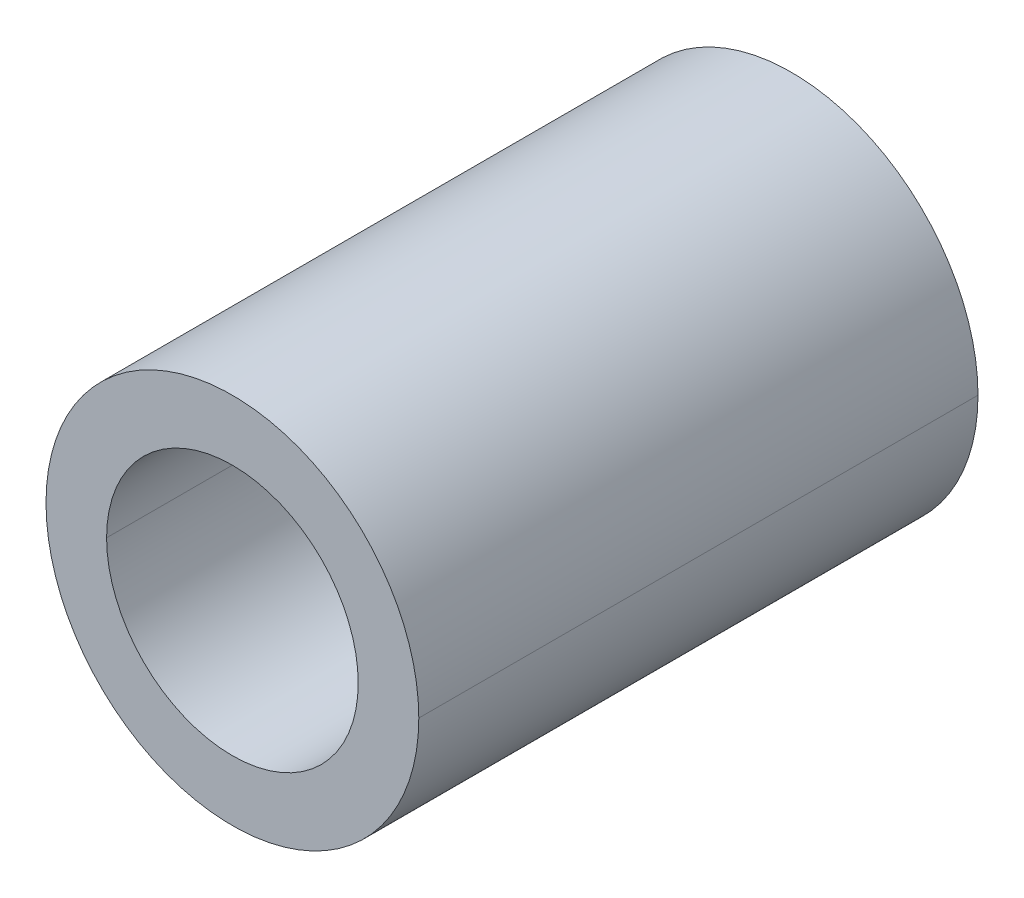
ISO-10303-21;
HEADER;
FILE_DESCRIPTION(('STEP AP214'),'2;1');
FILE_NAME('part.step','',(''),(''),'','','');
FILE_SCHEMA(('AUTOMOTIVE_DESIGN { 1 0 10303 214 1 1 1 1 }'));
ENDSEC;
DATA;
#1=APPLICATION_CONTEXT('core data for automotive mechanical design processes');
#2=APPLICATION_PROTOCOL_DEFINITION('international standard','automotive_design',2000,#1);
#3=PRODUCT_CONTEXT('',#1,'mechanical');
#4=PRODUCT('Part','Part','',(#3));
#5=PRODUCT_RELATED_PRODUCT_CATEGORY('part','',(#4));
#6=PRODUCT_DEFINITION_FORMATION('','',#4);
#7=PRODUCT_DEFINITION_CONTEXT('part definition',#1,'design');
#8=PRODUCT_DEFINITION('design','',#6,#7);
#9=PRODUCT_DEFINITION_SHAPE('','',#8);
#10=(LENGTH_UNIT() NAMED_UNIT(*) SI_UNIT(.MILLI.,.METRE.));
#11=(NAMED_UNIT(*) PLANE_ANGLE_UNIT() SI_UNIT($,.RADIAN.));
#12=(NAMED_UNIT(*) SI_UNIT($,.STERADIAN.) SOLID_ANGLE_UNIT());
#13=UNCERTAINTY_MEASURE_WITH_UNIT(LENGTH_MEASURE(1.E-05),#10,'distance_accuracy_value','');
#14=(GEOMETRIC_REPRESENTATION_CONTEXT(3) GLOBAL_UNCERTAINTY_ASSIGNED_CONTEXT((#13)) GLOBAL_UNIT_ASSIGNED_CONTEXT((#10,
#11,#12)) REPRESENTATION_CONTEXT('',''));
#15=CARTESIAN_POINT('',(0.,0.,0.));
#16=DIRECTION('',(0.,0.,1.));
#17=DIRECTION('',(1.,0.,0.));
#18=AXIS2_PLACEMENT_3D('',#15,#16,#17);
#19=CARTESIAN_POINT('',(0.,0.,6.));
#20=DIRECTION('',(0.,0.,-1.));
#21=DIRECTION('',(-1.,0.,0.));
#22=AXIS2_PLACEMENT_3D('',#19,#20,#21);
#23=CYLINDRICAL_SURFACE('',#22,1.35);
#24=DIRECTION('',(0.,0.,-1.));
#25=VECTOR('',#24,1.);
#26=CARTESIAN_POINT('',(1.35,0.,6.));
#27=LINE('',#26,#25);
#28=CARTESIAN_POINT('',(1.35,0.,6.));
#29=VERTEX_POINT('',#28);
#30=CARTESIAN_POINT('',(1.35,0.,0.));
#31=VERTEX_POINT('',#30);
#32=EDGE_CURVE('E110',#29,#31,#27,.T.);
#33=ORIENTED_EDGE('',*,*,#32,.F.);
#34=CARTESIAN_POINT('',(0.,0.,6.));
#35=DIRECTION('',(0.,0.,1.));
#36=DIRECTION('',(1.,0.,0.));
#37=AXIS2_PLACEMENT_3D('',#34,#35,#36);
#38=CIRCLE('',#37,1.35);
#39=CARTESIAN_POINT('',(-1.35,0.,6.));
#40=VERTEX_POINT('',#39);
#41=EDGE_CURVE('E65',#29,#40,#38,.T.);
#42=ORIENTED_EDGE('',*,*,#41,.T.);
#43=DIRECTION('',(0.,0.,-1.));
#44=VECTOR('',#43,1.);
#45=CARTESIAN_POINT('',(-1.35,0.,6.));
#46=LINE('',#45,#44);
#47=CARTESIAN_POINT('',(-1.35,0.,0.));
#48=VERTEX_POINT('',#47);
#49=EDGE_CURVE('E102',#40,#48,#46,.T.);
#50=ORIENTED_EDGE('',*,*,#49,.T.);
#51=CARTESIAN_POINT('',(0.,0.,0.));
#52=DIRECTION('',(0.,0.,1.));
#53=DIRECTION('',(1.,0.,0.));
#54=AXIS2_PLACEMENT_3D('',#51,#52,#53);
#55=CIRCLE('',#54,1.35);
#56=EDGE_CURVE('E11',#31,#48,#55,.T.);
#57=ORIENTED_EDGE('',*,*,#56,.F.);
#58=EDGE_LOOP('',(#33,#42,#50,#57));
#59=FACE_BOUND('',#58,.T.);
#60=ADVANCED_FACE('F17',(#59),#23,.F.);
#61=CARTESIAN_POINT('',(0.,0.,6.));
#62=DIRECTION('',(0.,0.,-1.));
#63=DIRECTION('',(-1.,0.,0.));
#64=AXIS2_PLACEMENT_3D('',#61,#62,#63);
#65=CYLINDRICAL_SURFACE('',#64,2.);
#66=DIRECTION('',(0.,0.,-1.));
#67=VECTOR('',#66,1.);
#68=CARTESIAN_POINT('',(2.,0.,6.));
#69=LINE('',#68,#67);
#70=CARTESIAN_POINT('',(2.,0.,6.));
#71=VERTEX_POINT('',#70);
#72=CARTESIAN_POINT('',(2.,0.,0.));
#73=VERTEX_POINT('',#72);
#74=EDGE_CURVE('E21',#71,#73,#69,.T.);
#75=ORIENTED_EDGE('',*,*,#74,.F.);
#76=CARTESIAN_POINT('',(0.,0.,6.));
#77=DIRECTION('',(0.,0.,1.));
#78=DIRECTION('',(1.,0.,0.));
#79=AXIS2_PLACEMENT_3D('',#76,#77,#78);
#80=CIRCLE('',#79,2.);
#81=CARTESIAN_POINT('',(-2.,0.,6.));
#82=VERTEX_POINT('',#81);
#83=EDGE_CURVE('E81',#82,#71,#80,.T.);
#84=ORIENTED_EDGE('',*,*,#83,.F.);
#85=DIRECTION('',(0.,0.,-1.));
#86=VECTOR('',#85,1.);
#87=CARTESIAN_POINT('',(-2.,0.,6.));
#88=LINE('',#87,#86);
#89=CARTESIAN_POINT('',(-2.,0.,0.));
#90=VERTEX_POINT('',#89);
#91=EDGE_CURVE('E92',#82,#90,#88,.T.);
#92=ORIENTED_EDGE('',*,*,#91,.T.);
#93=CARTESIAN_POINT('',(0.,0.,0.));
#94=DIRECTION('',(0.,0.,1.));
#95=DIRECTION('',(1.,0.,0.));
#96=AXIS2_PLACEMENT_3D('',#93,#94,#95);
#97=CIRCLE('',#96,2.);
#98=EDGE_CURVE('E28',#90,#73,#97,.T.);
#99=ORIENTED_EDGE('',*,*,#98,.T.);
#100=EDGE_LOOP('',(#75,#84,#92,#99));
#101=FACE_BOUND('',#100,.T.);
#102=ADVANCED_FACE('F95',(#101),#65,.T.);
#103=CARTESIAN_POINT('',(0.,0.,0.));
#104=DIRECTION('',(0.,0.,1.));
#105=DIRECTION('',(1.,0.,0.));
#106=AXIS2_PLACEMENT_3D('',#103,#104,#105);
#107=PLANE('',#106);
#108=CARTESIAN_POINT('',(0.,0.,0.));
#109=DIRECTION('',(0.,0.,1.));
#110=DIRECTION('',(1.,0.,0.));
#111=AXIS2_PLACEMENT_3D('',#108,#109,#110);
#112=CIRCLE('',#111,1.35);
#113=EDGE_CURVE('E107',#48,#31,#112,.T.);
#114=ORIENTED_EDGE('',*,*,#113,.T.);
#115=ORIENTED_EDGE('',*,*,#56,.T.);
#116=EDGE_LOOP('',(#114,#115));
#117=FACE_BOUND('',#116,.T.);
#118=ORIENTED_EDGE('',*,*,#98,.F.);
#119=CARTESIAN_POINT('',(0.,0.,0.));
#120=DIRECTION('',(0.,0.,1.));
#121=DIRECTION('',(1.,0.,0.));
#122=AXIS2_PLACEMENT_3D('',#119,#120,#121);
#123=CIRCLE('',#122,2.);
#124=EDGE_CURVE('E99',#73,#90,#123,.T.);
#125=ORIENTED_EDGE('',*,*,#124,.F.);
#126=EDGE_LOOP('',(#118,#125));
#127=FACE_BOUND('',#126,.T.);
#128=ADVANCED_FACE('F129',(#117,#127),#107,.F.);
#129=CARTESIAN_POINT('',(0.,0.,6.));
#130=DIRECTION('',(0.,0.,1.));
#131=DIRECTION('',(1.,0.,0.));
#132=AXIS2_PLACEMENT_3D('',#129,#130,#131);
#133=PLANE('',#132);
#134=CARTESIAN_POINT('',(0.,0.,6.));
#135=DIRECTION('',(0.,0.,1.));
#136=DIRECTION('',(1.,0.,0.));
#137=AXIS2_PLACEMENT_3D('',#134,#135,#136);
#138=CIRCLE('',#137,1.35);
#139=EDGE_CURVE('E113',#40,#29,#138,.T.);
#140=ORIENTED_EDGE('',*,*,#139,.F.);
#141=ORIENTED_EDGE('',*,*,#41,.F.);
#142=EDGE_LOOP('',(#140,#141));
#143=FACE_BOUND('',#142,.T.);
#144=ORIENTED_EDGE('',*,*,#83,.T.);
#145=CARTESIAN_POINT('',(0.,0.,6.));
#146=DIRECTION('',(0.,0.,1.));
#147=DIRECTION('',(1.,0.,0.));
#148=AXIS2_PLACEMENT_3D('',#145,#146,#147);
#149=CIRCLE('',#148,2.);
#150=EDGE_CURVE('E90',#71,#82,#149,.T.);
#151=ORIENTED_EDGE('',*,*,#150,.T.);
#152=EDGE_LOOP('',(#144,#151));
#153=FACE_BOUND('',#152,.T.);
#154=ADVANCED_FACE('F88',(#143,#153),#133,.T.);
#155=CARTESIAN_POINT('',(0.,0.,6.));
#156=DIRECTION('',(0.,0.,-1.));
#157=DIRECTION('',(-1.,0.,0.));
#158=AXIS2_PLACEMENT_3D('',#155,#156,#157);
#159=CYLINDRICAL_SURFACE('',#158,2.);
#160=ORIENTED_EDGE('',*,*,#150,.F.);
#161=ORIENTED_EDGE('',*,*,#74,.T.);
#162=ORIENTED_EDGE('',*,*,#124,.T.);
#163=ORIENTED_EDGE('',*,*,#91,.F.);
#164=EDGE_LOOP('',(#160,#161,#162,#163));
#165=FACE_BOUND('',#164,.T.);
#166=ADVANCED_FACE('F100',(#165),#159,.T.);
#167=CARTESIAN_POINT('',(0.,0.,6.));
#168=DIRECTION('',(0.,0.,-1.));
#169=DIRECTION('',(-1.,0.,0.));
#170=AXIS2_PLACEMENT_3D('',#167,#168,#169);
#171=CYLINDRICAL_SURFACE('',#170,1.35);
#172=ORIENTED_EDGE('',*,*,#139,.T.);
#173=ORIENTED_EDGE('',*,*,#32,.T.);
#174=ORIENTED_EDGE('',*,*,#113,.F.);
#175=ORIENTED_EDGE('',*,*,#49,.F.);
#176=EDGE_LOOP('',(#172,#173,#174,#175));
#177=FACE_BOUND('',#176,.T.);
#178=ADVANCED_FACE('F19',(#177),#171,.F.);
#179=CLOSED_SHELL('',(#60,#102,#128,#154,#166,#178));
#180=MANIFOLD_SOLID_BREP('B1',#179);
#181=ADVANCED_BREP_SHAPE_REPRESENTATION('',(#18,#180),#14);
#182=SHAPE_DEFINITION_REPRESENTATION(#9,#181);
ENDSEC;
END-ISO-10303-21;
